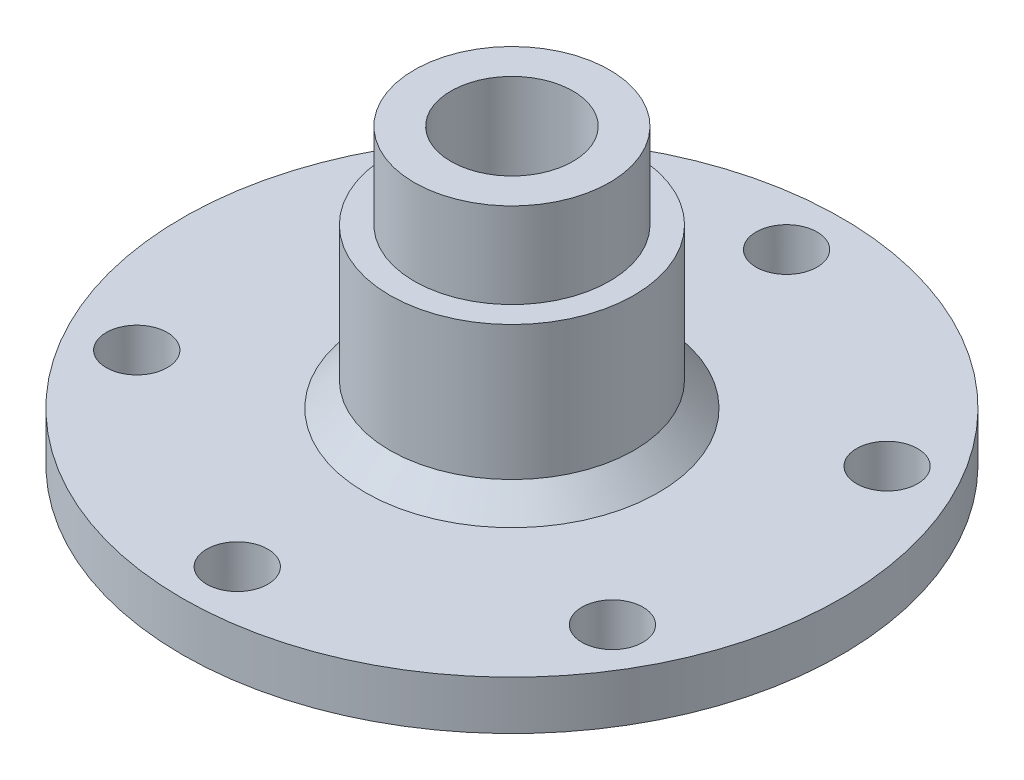
ISO-10303-21;
HEADER;
FILE_DESCRIPTION(('STEP AP214'),'2;1');
FILE_NAME('part.step','',(''),(''),'','','');
FILE_SCHEMA(('AUTOMOTIVE_DESIGN { 1 0 10303 214 1 1 1 1 }'));
ENDSEC;
DATA;
#1=APPLICATION_CONTEXT('core data for automotive mechanical design processes');
#2=APPLICATION_PROTOCOL_DEFINITION('international standard','automotive_design',2000,#1);
#3=PRODUCT_CONTEXT('',#1,'mechanical');
#4=PRODUCT('Part','Part','',(#3));
#5=PRODUCT_RELATED_PRODUCT_CATEGORY('part','',(#4));
#6=PRODUCT_DEFINITION_FORMATION('','',#4);
#7=PRODUCT_DEFINITION_CONTEXT('part definition',#1,'design');
#8=PRODUCT_DEFINITION('design','',#6,#7);
#9=PRODUCT_DEFINITION_SHAPE('','',#8);
#10=(LENGTH_UNIT() NAMED_UNIT(*) SI_UNIT(.MILLI.,.METRE.));
#11=(NAMED_UNIT(*) PLANE_ANGLE_UNIT() SI_UNIT($,.RADIAN.));
#12=(NAMED_UNIT(*) SI_UNIT($,.STERADIAN.) SOLID_ANGLE_UNIT());
#13=UNCERTAINTY_MEASURE_WITH_UNIT(LENGTH_MEASURE(1.E-05),#10,'distance_accuracy_value','');
#14=(GEOMETRIC_REPRESENTATION_CONTEXT(3) GLOBAL_UNCERTAINTY_ASSIGNED_CONTEXT((#13)) GLOBAL_UNIT_ASSIGNED_CONTEXT((#10,
#11,#12)) REPRESENTATION_CONTEXT('',''));
#15=CARTESIAN_POINT('',(0.,0.,0.));
#16=DIRECTION('',(0.,0.,1.));
#17=DIRECTION('',(1.,0.,0.));
#18=AXIS2_PLACEMENT_3D('',#15,#16,#17);
#19=CARTESIAN_POINT('',(-5.12,0.,0.));
#20=DIRECTION('',(0.,-1.,0.));
#21=DIRECTION('',(0.,0.,-1.));
#22=AXIS2_PLACEMENT_3D('',#19,#20,#21);
#23=PLANE('',#22);
#24=CARTESIAN_POINT('',(0.,0.,0.));
#25=DIRECTION('',(0.,1.,0.));
#26=DIRECTION('',(0.,0.,1.));
#27=AXIS2_PLACEMENT_3D('',#24,#25,#26);
#28=CIRCLE('',#27,2.56);
#29=CARTESIAN_POINT('',(0.,0.,2.56));
#30=VERTEX_POINT('',#29);
#31=EDGE_CURVE('E52',#30,#30,#28,.T.);
#32=ORIENTED_EDGE('',*,*,#31,.T.);
#33=EDGE_LOOP('',(#32));
#34=FACE_BOUND('',#33,.T.);
#35=CARTESIAN_POINT('',(0.,0.,0.));
#36=DIRECTION('',(0.,1.,0.));
#37=DIRECTION('',(0.,0.,1.));
#38=AXIS2_PLACEMENT_3D('',#35,#36,#37);
#39=CIRCLE('',#38,5.12);
#40=CARTESIAN_POINT('',(0.,0.,5.12));
#41=VERTEX_POINT('',#40);
#42=EDGE_CURVE('E42',#41,#41,#39,.T.);
#43=ORIENTED_EDGE('',*,*,#42,.F.);
#44=EDGE_LOOP('',(#43));
#45=FACE_BOUND('',#44,.T.);
#46=ADVANCED_FACE('F31',(#34,#45),#23,.T.);
#47=CARTESIAN_POINT('',(0.,0.,0.));
#48=DIRECTION('',(0.,1.,0.));
#49=DIRECTION('',(0.,0.,1.));
#50=AXIS2_PLACEMENT_3D('',#47,#48,#49);
#51=CYLINDRICAL_SURFACE('',#50,5.12);
#52=ORIENTED_EDGE('',*,*,#42,.T.);
#53=EDGE_LOOP('',(#52));
#54=FACE_BOUND('',#53,.T.);
#55=CARTESIAN_POINT('',(0.,1.024,0.));
#56=DIRECTION('',(0.,1.,0.));
#57=DIRECTION('',(0.,0.,1.));
#58=AXIS2_PLACEMENT_3D('',#55,#56,#57);
#59=CIRCLE('',#58,5.12);
#60=CARTESIAN_POINT('',(0.,1.024,5.12));
#61=VERTEX_POINT('',#60);
#62=EDGE_CURVE('E46',#61,#61,#59,.T.);
#63=ORIENTED_EDGE('',*,*,#62,.F.);
#64=EDGE_LOOP('',(#63));
#65=FACE_BOUND('',#64,.T.);
#66=ADVANCED_FACE('F115',(#54,#65),#51,.T.);
#67=CARTESIAN_POINT('',(-5.12,1.024,0.));
#68=DIRECTION('',(0.,-1.,0.));
#69=DIRECTION('',(0.,0.,-1.));
#70=AXIS2_PLACEMENT_3D('',#67,#68,#69);
#71=PLANE('',#70);
#72=CARTESIAN_POINT('',(0.,1.024,11.52));
#73=DIRECTION('',(0.,-1.,0.));
#74=DIRECTION('',(0.,0.,-1.));
#75=AXIS2_PLACEMENT_3D('',#72,#73,#74);
#76=CIRCLE('',#75,1.28);
#77=CARTESIAN_POINT('',(0.,1.024,10.24));
#78=VERTEX_POINT('',#77);
#79=EDGE_CURVE('E67',#78,#78,#76,.T.);
#80=ORIENTED_EDGE('',*,*,#79,.F.);
#81=EDGE_LOOP('',(#80));
#82=FACE_BOUND('',#81,.T.);
#83=CARTESIAN_POINT('',(-9.97661265159674,1.024,5.75999999999999));
#84=DIRECTION('',(0.,-1.,0.));
#85=DIRECTION('',(0.,0.,-1.));
#86=AXIS2_PLACEMENT_3D('',#83,#84,#85);
#87=CIRCLE('',#86,1.28000000000014);
#88=CARTESIAN_POINT('',(-9.97661265159674,1.024,4.47999999999986));
#89=VERTEX_POINT('',#88);
#90=EDGE_CURVE('E95',#89,#89,#87,.T.);
#91=ORIENTED_EDGE('',*,*,#90,.F.);
#92=EDGE_LOOP('',(#91));
#93=FACE_BOUND('',#92,.T.);
#94=CARTESIAN_POINT('',(-9.97661265159673,1.024,-5.76000000000001));
#95=DIRECTION('',(0.,-1.,0.));
#96=DIRECTION('',(0.,0.,-1.));
#97=AXIS2_PLACEMENT_3D('',#94,#95,#96);
#98=CIRCLE('',#97,1.28000000000011);
#99=CARTESIAN_POINT('',(-9.97661265159673,1.024,-7.04000000000012));
#100=VERTEX_POINT('',#99);
#101=EDGE_CURVE('E91',#100,#100,#98,.T.);
#102=ORIENTED_EDGE('',*,*,#101,.F.);
#103=EDGE_LOOP('',(#102));
#104=FACE_BOUND('',#103,.T.);
#105=CARTESIAN_POINT('',(0.,1.024,-11.52));
#106=DIRECTION('',(0.,-1.,0.));
#107=DIRECTION('',(0.,0.,-1.));
#108=AXIS2_PLACEMENT_3D('',#105,#106,#107);
#109=CIRCLE('',#108,1.28000000000008);
#110=CARTESIAN_POINT('',(0.,1.024,-12.8000000000001));
#111=VERTEX_POINT('',#110);
#112=EDGE_CURVE('E94',#111,#111,#109,.T.);
#113=ORIENTED_EDGE('',*,*,#112,.F.);
#114=EDGE_LOOP('',(#113));
#115=FACE_BOUND('',#114,.T.);
#116=CARTESIAN_POINT('',(9.97661265159674,1.024,-5.76));
#117=DIRECTION('',(0.,-1.,0.));
#118=DIRECTION('',(0.,0.,-1.));
#119=AXIS2_PLACEMENT_3D('',#116,#117,#118);
#120=CIRCLE('',#119,1.28000000000005);
#121=CARTESIAN_POINT('',(9.97661265159674,1.024,-7.04000000000005));
#122=VERTEX_POINT('',#121);
#123=EDGE_CURVE('E98',#122,#122,#120,.T.);
#124=ORIENTED_EDGE('',*,*,#123,.F.);
#125=EDGE_LOOP('',(#124));
#126=FACE_BOUND('',#125,.T.);
#127=CARTESIAN_POINT('',(9.97661265159674,1.024,5.76));
#128=DIRECTION('',(0.,-1.,0.));
#129=DIRECTION('',(0.,0.,-1.));
#130=AXIS2_PLACEMENT_3D('',#127,#128,#129);
#131=CIRCLE('',#130,1.28000000000003);
#132=CARTESIAN_POINT('',(9.97661265159674,1.024,4.47999999999997));
#133=VERTEX_POINT('',#132);
#134=EDGE_CURVE('E101',#133,#133,#131,.T.);
#135=ORIENTED_EDGE('',*,*,#134,.F.);
#136=EDGE_LOOP('',(#135));
#137=FACE_BOUND('',#136,.T.);
#138=ORIENTED_EDGE('',*,*,#62,.T.);
#139=EDGE_LOOP('',(#138));
#140=FACE_BOUND('',#139,.T.);
#141=CARTESIAN_POINT('',(0.,1.024,0.));
#142=DIRECTION('',(0.,1.,0.));
#143=DIRECTION('',(0.,0.,1.));
#144=AXIS2_PLACEMENT_3D('',#141,#142,#143);
#145=CIRCLE('',#144,13.824);
#146=CARTESIAN_POINT('',(0.,1.024,13.824));
#147=VERTEX_POINT('',#146);
#148=EDGE_CURVE('E71',#147,#147,#145,.T.);
#149=ORIENTED_EDGE('',*,*,#148,.F.);
#150=EDGE_LOOP('',(#149));
#151=FACE_BOUND('',#150,.T.);
#152=ADVANCED_FACE('F111',(#82,#93,#104,#115,#126,#137,#140,#151),#71,.T.);
#153=CARTESIAN_POINT('',(0.,0.,0.));
#154=DIRECTION('',(0.,1.,0.));
#155=DIRECTION('',(0.,0.,1.));
#156=AXIS2_PLACEMENT_3D('',#153,#154,#155);
#157=CYLINDRICAL_SURFACE('',#156,13.824);
#158=ORIENTED_EDGE('',*,*,#148,.T.);
#159=EDGE_LOOP('',(#158));
#160=FACE_BOUND('',#159,.T.);
#161=CARTESIAN_POINT('',(0.,3.072,0.));
#162=DIRECTION('',(0.,1.,0.));
#163=DIRECTION('',(0.,0.,1.));
#164=AXIS2_PLACEMENT_3D('',#161,#162,#163);
#165=CIRCLE('',#164,13.824);
#166=CARTESIAN_POINT('',(0.,3.072,13.824));
#167=VERTEX_POINT('',#166);
#168=EDGE_CURVE('E74',#167,#167,#165,.T.);
#169=ORIENTED_EDGE('',*,*,#168,.F.);
#170=EDGE_LOOP('',(#169));
#171=FACE_BOUND('',#170,.T.);
#172=ADVANCED_FACE('F114',(#160,#171),#157,.T.);
#173=CARTESIAN_POINT('',(-13.824,3.072,0.));
#174=DIRECTION('',(0.,1.,0.));
#175=DIRECTION('',(0.,0.,1.));
#176=AXIS2_PLACEMENT_3D('',#173,#174,#175);
#177=PLANE('',#176);
#178=CARTESIAN_POINT('',(0.,3.072,0.));
#179=DIRECTION('',(0.,1.,0.));
#180=DIRECTION('',(0.,0.,1.));
#181=AXIS2_PLACEMENT_3D('',#178,#179,#180);
#182=CIRCLE('',#181,6.144);
#183=CARTESIAN_POINT('',(0.,3.072,6.144));
#184=VERTEX_POINT('',#183);
#185=EDGE_CURVE('E10',#184,#184,#182,.F.);
#186=ORIENTED_EDGE('',*,*,#185,.T.);
#187=EDGE_LOOP('',(#186));
#188=FACE_BOUND('',#187,.T.);
#189=CARTESIAN_POINT('',(0.,3.072,11.52));
#190=DIRECTION('',(0.,1.,0.));
#191=DIRECTION('',(0.,0.,1.));
#192=AXIS2_PLACEMENT_3D('',#189,#190,#191);
#193=CIRCLE('',#192,1.28);
#194=CARTESIAN_POINT('',(0.,3.072,12.8));
#195=VERTEX_POINT('',#194);
#196=EDGE_CURVE('E49',#195,#195,#193,.T.);
#197=ORIENTED_EDGE('',*,*,#196,.F.);
#198=EDGE_LOOP('',(#197));
#199=FACE_BOUND('',#198,.T.);
#200=CARTESIAN_POINT('',(-9.97661265159674,3.072,5.75999999999999));
#201=DIRECTION('',(0.,1.,0.));
#202=DIRECTION('',(0.,0.,1.));
#203=AXIS2_PLACEMENT_3D('',#200,#201,#202);
#204=CIRCLE('',#203,1.28000000000014);
#205=CARTESIAN_POINT('',(-9.97661265159674,3.072,7.04000000000013));
#206=VERTEX_POINT('',#205);
#207=EDGE_CURVE('E53',#206,#206,#204,.T.);
#208=ORIENTED_EDGE('',*,*,#207,.F.);
#209=EDGE_LOOP('',(#208));
#210=FACE_BOUND('',#209,.T.);
#211=CARTESIAN_POINT('',(-9.97661265159673,3.072,-5.76000000000001));
#212=DIRECTION('',(0.,1.,0.));
#213=DIRECTION('',(0.,0.,1.));
#214=AXIS2_PLACEMENT_3D('',#211,#212,#213);
#215=CIRCLE('',#214,1.28000000000011);
#216=CARTESIAN_POINT('',(-9.97661265159673,3.072,-4.4799999999999));
#217=VERTEX_POINT('',#216);
#218=EDGE_CURVE('E56',#217,#217,#215,.T.);
#219=ORIENTED_EDGE('',*,*,#218,.F.);
#220=EDGE_LOOP('',(#219));
#221=FACE_BOUND('',#220,.T.);
#222=CARTESIAN_POINT('',(0.,3.072,-11.52));
#223=DIRECTION('',(0.,1.,0.));
#224=DIRECTION('',(0.,0.,1.));
#225=AXIS2_PLACEMENT_3D('',#222,#223,#224);
#226=CIRCLE('',#225,1.28000000000008);
#227=CARTESIAN_POINT('',(0.,3.072,-10.2399999999999));
#228=VERTEX_POINT('',#227);
#229=EDGE_CURVE('E59',#228,#228,#226,.T.);
#230=ORIENTED_EDGE('',*,*,#229,.F.);
#231=EDGE_LOOP('',(#230));
#232=FACE_BOUND('',#231,.T.);
#233=CARTESIAN_POINT('',(9.97661265159674,3.072,-5.76));
#234=DIRECTION('',(0.,1.,0.));
#235=DIRECTION('',(0.,0.,1.));
#236=AXIS2_PLACEMENT_3D('',#233,#234,#235);
#237=CIRCLE('',#236,1.28000000000005);
#238=CARTESIAN_POINT('',(9.97661265159674,3.072,-4.47999999999995));
#239=VERTEX_POINT('',#238);
#240=EDGE_CURVE('E62',#239,#239,#237,.T.);
#241=ORIENTED_EDGE('',*,*,#240,.F.);
#242=EDGE_LOOP('',(#241));
#243=FACE_BOUND('',#242,.T.);
#244=CARTESIAN_POINT('',(9.97661265159674,3.072,5.76));
#245=DIRECTION('',(0.,1.,0.));
#246=DIRECTION('',(0.,0.,1.));
#247=AXIS2_PLACEMENT_3D('',#244,#245,#246);
#248=CIRCLE('',#247,1.28000000000003);
#249=CARTESIAN_POINT('',(9.97661265159674,3.072,7.04000000000003));
#250=VERTEX_POINT('',#249);
#251=EDGE_CURVE('E65',#250,#250,#248,.T.);
#252=ORIENTED_EDGE('',*,*,#251,.F.);
#253=EDGE_LOOP('',(#252));
#254=FACE_BOUND('',#253,.T.);
#255=ORIENTED_EDGE('',*,*,#168,.T.);
#256=EDGE_LOOP('',(#255));
#257=FACE_BOUND('',#256,.T.);
#258=ADVANCED_FACE('F133',(#188,#199,#210,#221,#232,#243,#254,#257),#177,.T.);
#259=CARTESIAN_POINT('',(0.,0.,0.));
#260=DIRECTION('',(0.,1.,0.));
#261=DIRECTION('',(0.,0.,1.));
#262=AXIS2_PLACEMENT_3D('',#259,#260,#261);
#263=CYLINDRICAL_SURFACE('',#262,5.12);
#264=CARTESIAN_POINT('',(0.,4.09600000000001,0.));
#265=DIRECTION('',(0.,1.,0.));
#266=DIRECTION('',(0.,0.,1.));
#267=AXIS2_PLACEMENT_3D('',#264,#265,#266);
#268=CIRCLE('',#267,5.12);
#269=CARTESIAN_POINT('',(0.,4.09600000000001,5.12));
#270=VERTEX_POINT('',#269);
#271=EDGE_CURVE('E38',#270,#270,#268,.T.);
#272=ORIENTED_EDGE('',*,*,#271,.T.);
#273=EDGE_LOOP('',(#272));
#274=FACE_BOUND('',#273,.T.);
#275=CARTESIAN_POINT('',(0.,9.728,0.));
#276=DIRECTION('',(0.,1.,0.));
#277=DIRECTION('',(0.,0.,1.));
#278=AXIS2_PLACEMENT_3D('',#275,#276,#277);
#279=CIRCLE('',#278,5.12);
#280=CARTESIAN_POINT('',(0.,9.728,5.12));
#281=VERTEX_POINT('',#280);
#282=EDGE_CURVE('E77',#281,#281,#279,.T.);
#283=ORIENTED_EDGE('',*,*,#282,.F.);
#284=EDGE_LOOP('',(#283));
#285=FACE_BOUND('',#284,.T.);
#286=ADVANCED_FACE('F138',(#274,#285),#263,.T.);
#287=CARTESIAN_POINT('',(-5.12,9.728,0.));
#288=DIRECTION('',(0.,1.,0.));
#289=DIRECTION('',(0.,0.,1.));
#290=AXIS2_PLACEMENT_3D('',#287,#288,#289);
#291=PLANE('',#290);
#292=ORIENTED_EDGE('',*,*,#282,.T.);
#293=EDGE_LOOP('',(#292));
#294=FACE_BOUND('',#293,.T.);
#295=CARTESIAN_POINT('',(0.,9.728,0.));
#296=DIRECTION('',(0.,1.,0.));
#297=DIRECTION('',(0.,0.,1.));
#298=AXIS2_PLACEMENT_3D('',#295,#296,#297);
#299=CIRCLE('',#298,4.096);
#300=CARTESIAN_POINT('',(0.,9.728,4.096));
#301=VERTEX_POINT('',#300);
#302=EDGE_CURVE('E80',#301,#301,#299,.T.);
#303=ORIENTED_EDGE('',*,*,#302,.F.);
#304=EDGE_LOOP('',(#303));
#305=FACE_BOUND('',#304,.T.);
#306=ADVANCED_FACE('F143',(#294,#305),#291,.T.);
#307=CARTESIAN_POINT('',(0.,0.,0.));
#308=DIRECTION('',(0.,1.,0.));
#309=DIRECTION('',(0.,0.,1.));
#310=AXIS2_PLACEMENT_3D('',#307,#308,#309);
#311=CYLINDRICAL_SURFACE('',#310,4.096);
#312=ORIENTED_EDGE('',*,*,#302,.T.);
#313=EDGE_LOOP('',(#312));
#314=FACE_BOUND('',#313,.T.);
#315=CARTESIAN_POINT('',(0.,13.312,0.));
#316=DIRECTION('',(0.,1.,0.));
#317=DIRECTION('',(0.,0.,1.));
#318=AXIS2_PLACEMENT_3D('',#315,#316,#317);
#319=CIRCLE('',#318,4.096);
#320=CARTESIAN_POINT('',(0.,13.312,4.096));
#321=VERTEX_POINT('',#320);
#322=EDGE_CURVE('E83',#321,#321,#319,.T.);
#323=ORIENTED_EDGE('',*,*,#322,.F.);
#324=EDGE_LOOP('',(#323));
#325=FACE_BOUND('',#324,.T.);
#326=ADVANCED_FACE('F171',(#314,#325),#311,.T.);
#327=CARTESIAN_POINT('',(-4.096,13.312,0.));
#328=DIRECTION('',(0.,1.,0.));
#329=DIRECTION('',(0.,0.,1.));
#330=AXIS2_PLACEMENT_3D('',#327,#328,#329);
#331=PLANE('',#330);
#332=ORIENTED_EDGE('',*,*,#322,.T.);
#333=EDGE_LOOP('',(#332));
#334=FACE_BOUND('',#333,.T.);
#335=CARTESIAN_POINT('',(0.,13.312,0.));
#336=DIRECTION('',(0.,1.,0.));
#337=DIRECTION('',(0.,0.,1.));
#338=AXIS2_PLACEMENT_3D('',#335,#336,#337);
#339=CIRCLE('',#338,2.56);
#340=CARTESIAN_POINT('',(0.,13.312,2.56));
#341=VERTEX_POINT('',#340);
#342=EDGE_CURVE('E86',#341,#341,#339,.T.);
#343=ORIENTED_EDGE('',*,*,#342,.F.);
#344=EDGE_LOOP('',(#343));
#345=FACE_BOUND('',#344,.T.);
#346=ADVANCED_FACE('F161',(#334,#345),#331,.T.);
#347=CARTESIAN_POINT('',(0.,0.,0.));
#348=DIRECTION('',(0.,1.,0.));
#349=DIRECTION('',(0.,0.,1.));
#350=AXIS2_PLACEMENT_3D('',#347,#348,#349);
#351=CYLINDRICAL_SURFACE('',#350,2.56);
#352=ORIENTED_EDGE('',*,*,#342,.T.);
#353=EDGE_LOOP('',(#352));
#354=FACE_BOUND('',#353,.T.);
#355=ORIENTED_EDGE('',*,*,#31,.F.);
#356=EDGE_LOOP('',(#355));
#357=FACE_BOUND('',#356,.T.);
#358=ADVANCED_FACE('F158',(#354,#357),#351,.F.);
#359=CARTESIAN_POINT('',(9.97661265159674,6.144,5.76));
#360=DIRECTION('',(0.,-1.,0.));
#361=DIRECTION('',(0.,0.,-1.));
#362=AXIS2_PLACEMENT_3D('',#359,#360,#361);
#363=CYLINDRICAL_SURFACE('',#362,1.28000000000003);
#364=ORIENTED_EDGE('',*,*,#251,.T.);
#365=EDGE_LOOP('',(#364));
#366=FACE_BOUND('',#365,.T.);
#367=ORIENTED_EDGE('',*,*,#134,.T.);
#368=EDGE_LOOP('',(#367));
#369=FACE_BOUND('',#368,.T.);
#370=ADVANCED_FACE('F160',(#366,#369),#363,.F.);
#371=CARTESIAN_POINT('',(9.97661265159674,6.144,-5.76));
#372=DIRECTION('',(0.,-1.,0.));
#373=DIRECTION('',(0.,0.,-1.));
#374=AXIS2_PLACEMENT_3D('',#371,#372,#373);
#375=CYLINDRICAL_SURFACE('',#374,1.28000000000005);
#376=ORIENTED_EDGE('',*,*,#240,.T.);
#377=EDGE_LOOP('',(#376));
#378=FACE_BOUND('',#377,.T.);
#379=ORIENTED_EDGE('',*,*,#123,.T.);
#380=EDGE_LOOP('',(#379));
#381=FACE_BOUND('',#380,.T.);
#382=ADVANCED_FACE('F168',(#378,#381),#375,.F.);
#383=CARTESIAN_POINT('',(0.,6.144,-11.52));
#384=DIRECTION('',(0.,-1.,0.));
#385=DIRECTION('',(0.,0.,-1.));
#386=AXIS2_PLACEMENT_3D('',#383,#384,#385);
#387=CYLINDRICAL_SURFACE('',#386,1.28000000000008);
#388=ORIENTED_EDGE('',*,*,#229,.T.);
#389=EDGE_LOOP('',(#388));
#390=FACE_BOUND('',#389,.T.);
#391=ORIENTED_EDGE('',*,*,#112,.T.);
#392=EDGE_LOOP('',(#391));
#393=FACE_BOUND('',#392,.T.);
#394=ADVANCED_FACE('F223',(#390,#393),#387,.F.);
#395=CARTESIAN_POINT('',(-9.97661265159673,6.144,-5.76000000000001));
#396=DIRECTION('',(0.,-1.,0.));
#397=DIRECTION('',(0.,0.,-1.));
#398=AXIS2_PLACEMENT_3D('',#395,#396,#397);
#399=CYLINDRICAL_SURFACE('',#398,1.28000000000011);
#400=ORIENTED_EDGE('',*,*,#218,.T.);
#401=EDGE_LOOP('',(#400));
#402=FACE_BOUND('',#401,.T.);
#403=ORIENTED_EDGE('',*,*,#101,.T.);
#404=EDGE_LOOP('',(#403));
#405=FACE_BOUND('',#404,.T.);
#406=ADVANCED_FACE('F175',(#402,#405),#399,.F.);
#407=CARTESIAN_POINT('',(-9.97661265159674,6.144,5.75999999999999));
#408=DIRECTION('',(0.,-1.,0.));
#409=DIRECTION('',(0.,0.,-1.));
#410=AXIS2_PLACEMENT_3D('',#407,#408,#409);
#411=CYLINDRICAL_SURFACE('',#410,1.28000000000014);
#412=ORIENTED_EDGE('',*,*,#207,.T.);
#413=EDGE_LOOP('',(#412));
#414=FACE_BOUND('',#413,.T.);
#415=ORIENTED_EDGE('',*,*,#90,.T.);
#416=EDGE_LOOP('',(#415));
#417=FACE_BOUND('',#416,.T.);
#418=ADVANCED_FACE('F241',(#414,#417),#411,.F.);
#419=CARTESIAN_POINT('',(0.,6.144,11.52));
#420=DIRECTION('',(0.,-1.,0.));
#421=DIRECTION('',(0.,0.,-1.));
#422=AXIS2_PLACEMENT_3D('',#419,#420,#421);
#423=CYLINDRICAL_SURFACE('',#422,1.28);
#424=ORIENTED_EDGE('',*,*,#196,.T.);
#425=EDGE_LOOP('',(#424));
#426=FACE_BOUND('',#425,.T.);
#427=ORIENTED_EDGE('',*,*,#79,.T.);
#428=EDGE_LOOP('',(#427));
#429=FACE_BOUND('',#428,.T.);
#430=ADVANCED_FACE('F109',(#426,#429),#423,.F.);
#431=CARTESIAN_POINT('',(0.,4.09600000000001,0.));
#432=DIRECTION('',(0.,-1.,0.));
#433=DIRECTION('',(0.,0.,-1.));
#434=AXIS2_PLACEMENT_3D('',#431,#432,#433);
#435=CONICAL_SURFACE('',#434,5.12,0.785398163397445);
#436=ORIENTED_EDGE('',*,*,#185,.F.);
#437=EDGE_LOOP('',(#436));
#438=FACE_BOUND('',#437,.T.);
#439=ORIENTED_EDGE('',*,*,#271,.F.);
#440=EDGE_LOOP('',(#439));
#441=FACE_BOUND('',#440,.T.);
#442=ADVANCED_FACE('F33',(#438,#441),#435,.T.);
#443=CLOSED_SHELL('',(#46,#66,#152,#172,#258,#286,#306,#326,#346,#358,#370,#382,#394,#406,#418,
#430,#442));
#444=MANIFOLD_SOLID_BREP('B2',#443);
#445=ADVANCED_BREP_SHAPE_REPRESENTATION('',(#18,#444),#14);
#446=SHAPE_DEFINITION_REPRESENTATION(#9,#445);
ENDSEC;
END-ISO-10303-21;
